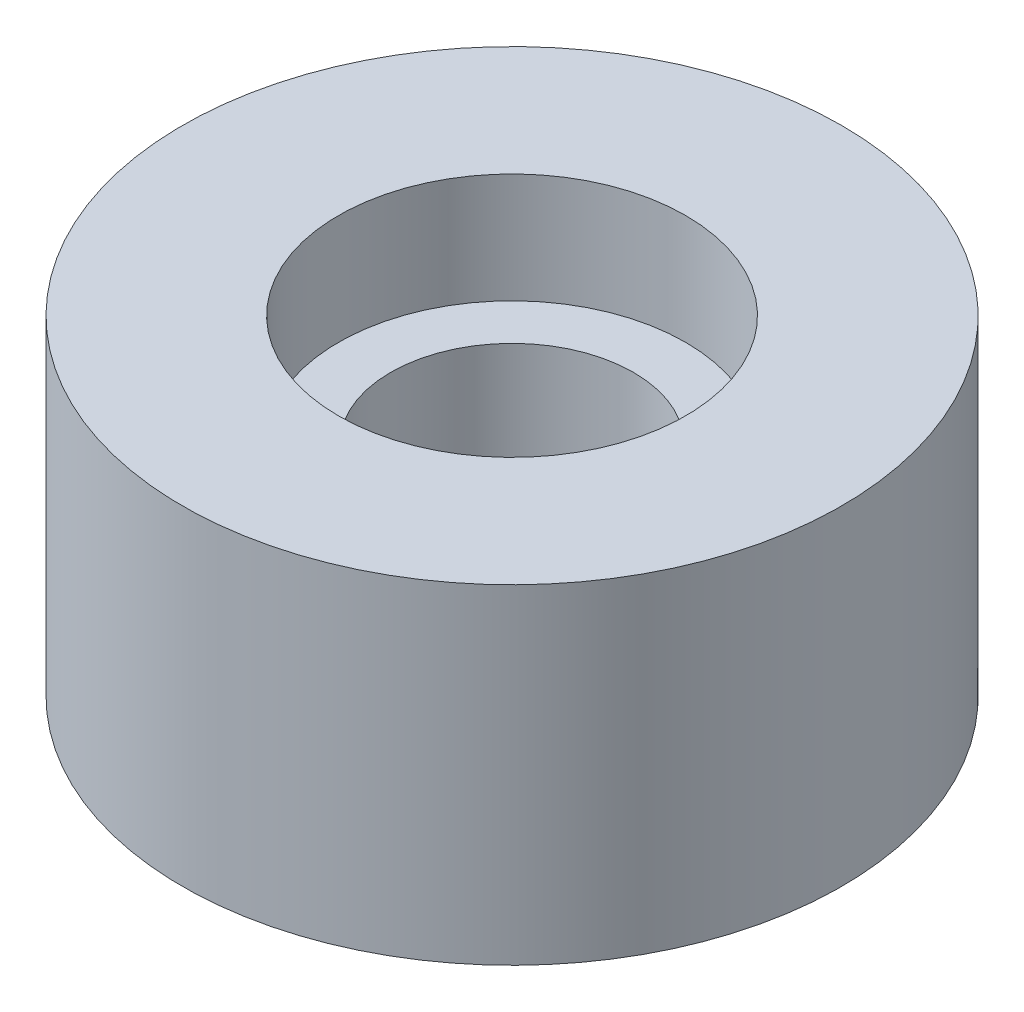
ISO-10303-21;
HEADER;
FILE_DESCRIPTION(('STEP AP214'),'2;1');
FILE_NAME('part.step','',(''),(''),'','','');
FILE_SCHEMA(('AUTOMOTIVE_DESIGN { 1 0 10303 214 1 1 1 1 }'));
ENDSEC;
DATA;
#1=APPLICATION_CONTEXT('core data for automotive mechanical design processes');
#2=APPLICATION_PROTOCOL_DEFINITION('international standard','automotive_design',2000,#1);
#3=PRODUCT_CONTEXT('',#1,'mechanical');
#4=PRODUCT('Part','Part','',(#3));
#5=PRODUCT_RELATED_PRODUCT_CATEGORY('part','',(#4));
#6=PRODUCT_DEFINITION_FORMATION('','',#4);
#7=PRODUCT_DEFINITION_CONTEXT('part definition',#1,'design');
#8=PRODUCT_DEFINITION('design','',#6,#7);
#9=PRODUCT_DEFINITION_SHAPE('','',#8);
#10=(LENGTH_UNIT() NAMED_UNIT(*) SI_UNIT(.MILLI.,.METRE.));
#11=(NAMED_UNIT(*) PLANE_ANGLE_UNIT() SI_UNIT($,.RADIAN.));
#12=(NAMED_UNIT(*) SI_UNIT($,.STERADIAN.) SOLID_ANGLE_UNIT());
#13=UNCERTAINTY_MEASURE_WITH_UNIT(LENGTH_MEASURE(1.E-05),#10,'distance_accuracy_value','');
#14=(GEOMETRIC_REPRESENTATION_CONTEXT(3) GLOBAL_UNCERTAINTY_ASSIGNED_CONTEXT((#13)) GLOBAL_UNIT_ASSIGNED_CONTEXT((#10,
#11,#12)) REPRESENTATION_CONTEXT('',''));
#15=CARTESIAN_POINT('',(0.,0.,0.));
#16=DIRECTION('',(0.,0.,1.));
#17=DIRECTION('',(1.,0.,0.));
#18=AXIS2_PLACEMENT_3D('',#15,#16,#17);
#19=CARTESIAN_POINT('',(0.,76.2,0.));
#20=DIRECTION('',(0.,-1.,0.));
#21=DIRECTION('',(0.,0.,-1.));
#22=AXIS2_PLACEMENT_3D('',#19,#20,#21);
#23=CYLINDRICAL_SURFACE('',#22,14.0462);
#24=CARTESIAN_POINT('',(0.,25.4,0.));
#25=DIRECTION('',(0.,1.,0.));
#26=DIRECTION('',(0.,0.,1.));
#27=AXIS2_PLACEMENT_3D('',#24,#25,#26);
#28=CIRCLE('',#27,14.0462);
#29=CARTESIAN_POINT('',(0.,25.4,-14.0462));
#30=VERTEX_POINT('',#29);
#31=EDGE_CURVE('E56',#30,#30,#28,.F.);
#32=CARTESIAN_POINT('',(0.,12.7,0.));
#33=DIRECTION('',(0.,-1.,0.));
#34=DIRECTION('',(0.,0.,-1.));
#35=AXIS2_PLACEMENT_3D('',#32,#33,#34);
#36=CIRCLE('',#35,14.0462);
#37=CARTESIAN_POINT('',(0.,12.7,-14.0462));
#38=VERTEX_POINT('',#37);
#39=EDGE_CURVE('E45',#38,#38,#36,.F.);
#40=CARTESIAN_POINT('',(0.,25.4,-14.0462));
#41=CARTESIAN_POINT('',(0.,25.2677083333333,-14.0462));
#42=CARTESIAN_POINT('',(0.,25.1354166666667,-14.0462));
#43=CARTESIAN_POINT('',(0.,24.8708333333333,-14.0462));
#44=CARTESIAN_POINT('',(0.,24.7385416666667,-14.0462));
#45=CARTESIAN_POINT('',(0.,24.4739583333333,-14.0462));
#46=CARTESIAN_POINT('',(0.,24.3416666666667,-14.0462));
#47=CARTESIAN_POINT('',(0.,24.0770833333333,-14.0462));
#48=CARTESIAN_POINT('',(0.,23.9447916666667,-14.0462));
#49=CARTESIAN_POINT('',(0.,23.6802083333333,-14.0462));
#50=CARTESIAN_POINT('',(0.,23.5479166666667,-14.0462));
#51=CARTESIAN_POINT('',(0.,23.2833333333333,-14.0462));
#52=CARTESIAN_POINT('',(0.,23.1510416666667,-14.0462));
#53=CARTESIAN_POINT('',(0.,22.8864583333333,-14.0462));
#54=CARTESIAN_POINT('',(0.,22.7541666666667,-14.0462));
#55=CARTESIAN_POINT('',(0.,22.4895833333333,-14.0462));
#56=CARTESIAN_POINT('',(0.,22.3572916666667,-14.0462));
#57=CARTESIAN_POINT('',(0.,22.0927083333333,-14.0462));
#58=CARTESIAN_POINT('',(0.,21.9604166666667,-14.0462));
#59=CARTESIAN_POINT('',(0.,21.6958333333333,-14.0462));
#60=CARTESIAN_POINT('',(0.,21.5635416666667,-14.0462));
#61=CARTESIAN_POINT('',(0.,21.2989583333333,-14.0462));
#62=CARTESIAN_POINT('',(0.,21.1666666666667,-14.0462));
#63=CARTESIAN_POINT('',(0.,20.9020833333333,-14.0462));
#64=CARTESIAN_POINT('',(0.,20.7697916666667,-14.0462));
#65=CARTESIAN_POINT('',(0.,20.5052083333333,-14.0462));
#66=CARTESIAN_POINT('',(0.,20.3729166666667,-14.0462));
#67=CARTESIAN_POINT('',(0.,20.1083333333333,-14.0462));
#68=CARTESIAN_POINT('',(0.,19.9760416666667,-14.0462));
#69=CARTESIAN_POINT('',(0.,19.7114583333333,-14.0462));
#70=CARTESIAN_POINT('',(0.,19.5791666666667,-14.0462));
#71=CARTESIAN_POINT('',(0.,19.3145833333333,-14.0462));
#72=CARTESIAN_POINT('',(0.,19.1822916666667,-14.0462));
#73=CARTESIAN_POINT('',(0.,18.9177083333333,-14.0462));
#74=CARTESIAN_POINT('',(0.,18.7854166666667,-14.0462));
#75=CARTESIAN_POINT('',(0.,18.5208333333333,-14.0462));
#76=CARTESIAN_POINT('',(0.,18.3885416666667,-14.0462));
#77=CARTESIAN_POINT('',(0.,18.1239583333333,-14.0462));
#78=CARTESIAN_POINT('',(0.,17.9916666666667,-14.0462));
#79=CARTESIAN_POINT('',(0.,17.7270833333333,-14.0462));
#80=CARTESIAN_POINT('',(0.,17.5947916666667,-14.0462));
#81=CARTESIAN_POINT('',(0.,17.3302083333333,-14.0462));
#82=CARTESIAN_POINT('',(0.,17.1979166666667,-14.0462));
#83=CARTESIAN_POINT('',(0.,16.9333333333333,-14.0462));
#84=CARTESIAN_POINT('',(0.,16.8010416666667,-14.0462));
#85=CARTESIAN_POINT('',(0.,16.5364583333333,-14.0462));
#86=CARTESIAN_POINT('',(0.,16.4041666666667,-14.0462));
#87=CARTESIAN_POINT('',(0.,16.1395833333333,-14.0462));
#88=CARTESIAN_POINT('',(0.,16.0072916666667,-14.0462));
#89=CARTESIAN_POINT('',(0.,15.7427083333333,-14.0462));
#90=CARTESIAN_POINT('',(0.,15.6104166666667,-14.0462));
#91=CARTESIAN_POINT('',(0.,15.3458333333333,-14.0462));
#92=CARTESIAN_POINT('',(0.,15.2135416666667,-14.0462));
#93=CARTESIAN_POINT('',(0.,14.9489583333333,-14.0462));
#94=CARTESIAN_POINT('',(0.,14.8166666666667,-14.0462));
#95=CARTESIAN_POINT('',(0.,14.5520833333333,-14.0462));
#96=CARTESIAN_POINT('',(0.,14.4197916666667,-14.0462));
#97=CARTESIAN_POINT('',(0.,14.1552083333333,-14.0462));
#98=CARTESIAN_POINT('',(0.,14.0229166666667,-14.0462));
#99=CARTESIAN_POINT('',(0.,13.7583333333333,-14.0462));
#100=CARTESIAN_POINT('',(0.,13.6260416666667,-14.0462));
#101=CARTESIAN_POINT('',(0.,13.3614583333333,-14.0462));
#102=CARTESIAN_POINT('',(0.,13.2291666666667,-14.0462));
#103=CARTESIAN_POINT('',(0.,12.9645833333334,-14.0462));
#104=CARTESIAN_POINT('',(0.,12.8322916666667,-14.0462));
#105=CARTESIAN_POINT('',(0.,12.7,-14.0462));
#106=B_SPLINE_CURVE_WITH_KNOTS('',3,(#40,#41,#42,#43,#44,#45,#46,#47,#48,#49,#50,#51,#52,#53,
#54,#55,#56,#57,#58,#59,#60,#61,#62,#63,#64,#65,#66,#67,#68,#69,#70,#71,#72,#73,#74,#75,#76,#77,
#78,#79,#80,#81,#82,#83,#84,#85,#86,#87,#88,#89,#90,#91,#92,#93,#94,#95,#96,#97,#98,#99,#100,
#101,#102,#103,#104,#105),.UNSPECIFIED.,.F.,.F.,(4,2,2,2,2,2,2,2,2,2,2,2,2,2,2,2,2,2,2,2,2,2,2,
2,2,2,2,2,2,2,2,2,4),(0.,0.396874999999998,0.793749999999996,1.190625,1.5875,1.984375,2.38125,
2.778125,3.175,3.571875,3.96874999999999,4.365625,4.7625,5.15937499999999,5.55625,5.953125,
6.34999999999999,6.74687499999999,7.14374999999999,7.540625,7.93749999999999,8.33437499999999,
8.73125,9.12812499999999,9.52499999999999,9.92187499999999,10.31875,10.715625,11.1125,11.509375,
11.90625,12.303125,12.7),.UNSPECIFIED.);
#107=EDGE_CURVE('BSEAM41',#30,#38,#106,.T.);
#108=ORIENTED_EDGE('',*,*,#31,.F.);
#109=ORIENTED_EDGE('',*,*,#39,.F.);
#110=ORIENTED_EDGE('',*,*,#107,.T.);
#111=ORIENTED_EDGE('',*,*,#107,.F.);
#112=EDGE_LOOP('',(#108,#110,#109,#111));
#113=FACE_BOUND('',#112,.T.);
#114=ADVANCED_FACE('F41',(#113),#23,.F.);
#115=CARTESIAN_POINT('',(0.,38.1,0.));
#116=DIRECTION('',(0.,-1.,0.));
#117=DIRECTION('',(0.,0.,-1.));
#118=AXIS2_PLACEMENT_3D('',#115,#116,#117);
#119=CYLINDRICAL_SURFACE('',#118,38.1);
#120=CARTESIAN_POINT('',(0.,38.1,0.));
#121=DIRECTION('',(0.,1.,0.));
#122=DIRECTION('',(0.,0.,1.));
#123=AXIS2_PLACEMENT_3D('',#120,#121,#122);
#124=CIRCLE('',#123,38.1);
#125=CARTESIAN_POINT('',(0.,38.1,-38.1));
#126=VERTEX_POINT('',#125);
#127=EDGE_CURVE('E10',#126,#126,#124,.T.);
#128=CARTESIAN_POINT('',(0.,0.,0.));
#129=DIRECTION('',(0.,1.,0.));
#130=DIRECTION('',(0.,0.,1.));
#131=AXIS2_PLACEMENT_3D('',#128,#129,#130);
#132=CIRCLE('',#131,38.1);
#133=CARTESIAN_POINT('',(0.,0.,-38.1));
#134=VERTEX_POINT('',#133);
#135=EDGE_CURVE('E50',#134,#134,#132,.T.);
#136=CARTESIAN_POINT('',(0.,38.1,-38.1));
#137=CARTESIAN_POINT('',(0.,37.703125,-38.1));
#138=CARTESIAN_POINT('',(0.,37.30625,-38.1));
#139=CARTESIAN_POINT('',(0.,36.5125,-38.1));
#140=CARTESIAN_POINT('',(0.,36.115625,-38.1));
#141=CARTESIAN_POINT('',(0.,35.321875,-38.1));
#142=CARTESIAN_POINT('',(0.,34.925,-38.1));
#143=CARTESIAN_POINT('',(0.,34.13125,-38.1));
#144=CARTESIAN_POINT('',(0.,33.734375,-38.1));
#145=CARTESIAN_POINT('',(0.,32.940625,-38.1));
#146=CARTESIAN_POINT('',(0.,32.54375,-38.1));
#147=CARTESIAN_POINT('',(0.,31.75,-38.1));
#148=CARTESIAN_POINT('',(0.,31.353125,-38.1));
#149=CARTESIAN_POINT('',(0.,30.559375,-38.1));
#150=CARTESIAN_POINT('',(0.,30.1625,-38.1));
#151=CARTESIAN_POINT('',(0.,29.36875,-38.1));
#152=CARTESIAN_POINT('',(0.,28.971875,-38.1));
#153=CARTESIAN_POINT('',(0.,28.178125,-38.1));
#154=CARTESIAN_POINT('',(0.,27.78125,-38.1));
#155=CARTESIAN_POINT('',(0.,26.9875,-38.1));
#156=CARTESIAN_POINT('',(0.,26.590625,-38.1));
#157=CARTESIAN_POINT('',(0.,25.796875,-38.1));
#158=CARTESIAN_POINT('',(0.,25.4,-38.1));
#159=CARTESIAN_POINT('',(0.,24.60625,-38.1));
#160=CARTESIAN_POINT('',(0.,24.209375,-38.1));
#161=CARTESIAN_POINT('',(0.,23.415625,-38.1));
#162=CARTESIAN_POINT('',(0.,23.01875,-38.1));
#163=CARTESIAN_POINT('',(0.,22.225,-38.1));
#164=CARTESIAN_POINT('',(0.,21.828125,-38.1));
#165=CARTESIAN_POINT('',(0.,21.034375,-38.1));
#166=CARTESIAN_POINT('',(0.,20.6375,-38.1));
#167=CARTESIAN_POINT('',(0.,19.84375,-38.1));
#168=CARTESIAN_POINT('',(0.,19.446875,-38.1));
#169=CARTESIAN_POINT('',(0.,18.653125,-38.1));
#170=CARTESIAN_POINT('',(0.,18.25625,-38.1));
#171=CARTESIAN_POINT('',(0.,17.4625,-38.1));
#172=CARTESIAN_POINT('',(0.,17.065625,-38.1));
#173=CARTESIAN_POINT('',(0.,16.271875,-38.1));
#174=CARTESIAN_POINT('',(0.,15.875,-38.1));
#175=CARTESIAN_POINT('',(0.,15.08125,-38.1));
#176=CARTESIAN_POINT('',(0.,14.684375,-38.1));
#177=CARTESIAN_POINT('',(0.,13.890625,-38.1));
#178=CARTESIAN_POINT('',(0.,13.49375,-38.1));
#179=CARTESIAN_POINT('',(0.,12.7,-38.1));
#180=CARTESIAN_POINT('',(0.,12.303125,-38.1));
#181=CARTESIAN_POINT('',(0.,11.509375,-38.1));
#182=CARTESIAN_POINT('',(0.,11.1125,-38.1));
#183=CARTESIAN_POINT('',(0.,10.31875,-38.1));
#184=CARTESIAN_POINT('',(0.,9.92187499999999,-38.1));
#185=CARTESIAN_POINT('',(0.,9.128125,-38.1));
#186=CARTESIAN_POINT('',(0.,8.73124999999999,-38.1));
#187=CARTESIAN_POINT('',(0.,7.93749999999999,-38.1));
#188=CARTESIAN_POINT('',(0.,7.54062499999999,-38.1));
#189=CARTESIAN_POINT('',(0.,6.746875,-38.1));
#190=CARTESIAN_POINT('',(0.,6.35,-38.1));
#191=CARTESIAN_POINT('',(0.,5.55625,-38.1));
#192=CARTESIAN_POINT('',(0.,5.159375,-38.1));
#193=CARTESIAN_POINT('',(0.,4.365625,-38.1));
#194=CARTESIAN_POINT('',(0.,3.96875,-38.1));
#195=CARTESIAN_POINT('',(0.,3.175,-38.1));
#196=CARTESIAN_POINT('',(0.,2.778125,-38.1));
#197=CARTESIAN_POINT('',(0.,1.984375,-38.1));
#198=CARTESIAN_POINT('',(0.,1.5875,-38.1));
#199=CARTESIAN_POINT('',(0.,0.79375,-38.1));
#200=CARTESIAN_POINT('',(0.,0.396875,-38.1));
#201=CARTESIAN_POINT('',(0.,0.,-38.1));
#202=B_SPLINE_CURVE_WITH_KNOTS('',3,(#136,#137,#138,#139,#140,#141,#142,#143,#144,#145,#146,
#147,#148,#149,#150,#151,#152,#153,#154,#155,#156,#157,#158,#159,#160,#161,#162,#163,#164,#165,
#166,#167,#168,#169,#170,#171,#172,#173,#174,#175,#176,#177,#178,#179,#180,#181,#182,#183,#184,
#185,#186,#187,#188,#189,#190,#191,#192,#193,#194,#195,#196,#197,#198,#199,#200,#201),
.UNSPECIFIED.,.F.,.F.,(4,2,2,2,2,2,2,2,2,2,2,2,2,2,2,2,2,2,2,2,2,2,2,2,2,2,2,2,2,2,2,2,4),(0.,
1.190625,2.38125,3.571875,4.7625,5.953125,7.14375,8.334375,9.52500000000001,10.715625,11.90625,
13.096875,14.2875,15.478125,16.66875,17.859375,19.05,20.240625,21.43125,22.621875,23.8125,
25.003125,26.19375,27.384375,28.575,29.765625,30.95625,32.146875,33.3375,34.528125,35.71875,
36.909375,38.1),.UNSPECIFIED.);
#203=EDGE_CURVE('BSEAM43',#126,#134,#202,.T.);
#204=ORIENTED_EDGE('',*,*,#127,.F.);
#205=ORIENTED_EDGE('',*,*,#135,.T.);
#206=ORIENTED_EDGE('',*,*,#203,.T.);
#207=ORIENTED_EDGE('',*,*,#203,.F.);
#208=EDGE_LOOP('',(#204,#206,#205,#207));
#209=FACE_BOUND('',#208,.T.);
#210=ADVANCED_FACE('F43',(#209),#119,.T.);
#211=CARTESIAN_POINT('',(0.,38.1,0.));
#212=DIRECTION('',(0.,1.,0.));
#213=DIRECTION('',(0.,0.,1.));
#214=AXIS2_PLACEMENT_3D('',#211,#212,#213);
#215=PLANE('',#214);
#216=CARTESIAN_POINT('',(0.,38.1,0.));
#217=DIRECTION('',(0.,1.,0.));
#218=DIRECTION('',(0.,0.,1.));
#219=AXIS2_PLACEMENT_3D('',#216,#217,#218);
#220=CIRCLE('',#219,20.066);
#221=CARTESIAN_POINT('',(0.,38.1,20.066));
#222=VERTEX_POINT('',#221);
#223=EDGE_CURVE('E59',#222,#222,#220,.T.);
#224=ORIENTED_EDGE('',*,*,#223,.F.);
#225=EDGE_LOOP('',(#224));
#226=FACE_BOUND('',#225,.T.);
#227=ORIENTED_EDGE('',*,*,#127,.T.);
#228=EDGE_LOOP('',(#227));
#229=FACE_BOUND('',#228,.T.);
#230=ADVANCED_FACE('F94',(#226,#229),#215,.T.);
#231=CARTESIAN_POINT('',(0.,0.,0.));
#232=DIRECTION('',(0.,1.,0.));
#233=DIRECTION('',(0.,0.,1.));
#234=AXIS2_PLACEMENT_3D('',#231,#232,#233);
#235=PLANE('',#234);
#236=CARTESIAN_POINT('',(0.,0.,0.));
#237=DIRECTION('',(0.,-1.,0.));
#238=DIRECTION('',(0.,0.,-1.));
#239=AXIS2_PLACEMENT_3D('',#236,#237,#238);
#240=CIRCLE('',#239,30.0355);
#241=CARTESIAN_POINT('',(0.,0.,-30.0355));
#242=VERTEX_POINT('',#241);
#243=EDGE_CURVE('E73',#242,#242,#240,.T.);
#244=ORIENTED_EDGE('',*,*,#243,.F.);
#245=EDGE_LOOP('',(#244));
#246=FACE_BOUND('',#245,.T.);
#247=ORIENTED_EDGE('',*,*,#135,.F.);
#248=EDGE_LOOP('',(#247));
#249=FACE_BOUND('',#248,.T.);
#250=ADVANCED_FACE('F101',(#246,#249),#235,.F.);
#251=CARTESIAN_POINT('',(0.,25.4,0.));
#252=DIRECTION('',(0.,1.,0.));
#253=DIRECTION('',(0.,0.,1.));
#254=AXIS2_PLACEMENT_3D('',#251,#252,#253);
#255=PLANE('',#254);
#256=CARTESIAN_POINT('',(0.,25.4,0.));
#257=DIRECTION('',(0.,1.,0.));
#258=DIRECTION('',(0.,0.,1.));
#259=AXIS2_PLACEMENT_3D('',#256,#257,#258);
#260=CIRCLE('',#259,20.066);
#261=CARTESIAN_POINT('',(0.,25.4,20.066));
#262=VERTEX_POINT('',#261);
#263=EDGE_CURVE('E63',#262,#262,#260,.T.);
#264=ORIENTED_EDGE('',*,*,#263,.T.);
#265=EDGE_LOOP('',(#264));
#266=FACE_BOUND('',#265,.T.);
#267=ORIENTED_EDGE('',*,*,#31,.T.);
#268=EDGE_LOOP('',(#267));
#269=FACE_BOUND('',#268,.T.);
#270=ADVANCED_FACE('F104',(#266,#269),#255,.T.);
#271=CARTESIAN_POINT('',(0.,25.4,0.));
#272=DIRECTION('',(0.,1.,0.));
#273=DIRECTION('',(0.,0.,1.));
#274=AXIS2_PLACEMENT_3D('',#271,#272,#273);
#275=CYLINDRICAL_SURFACE('',#274,20.066);
#276=ORIENTED_EDGE('',*,*,#263,.F.);
#277=EDGE_LOOP('',(#276));
#278=FACE_BOUND('',#277,.T.);
#279=ORIENTED_EDGE('',*,*,#223,.T.);
#280=EDGE_LOOP('',(#279));
#281=FACE_BOUND('',#280,.T.);
#282=ADVANCED_FACE('F98',(#278,#281),#275,.F.);
#283=CARTESIAN_POINT('',(0.,12.7,0.));
#284=DIRECTION('',(0.,-1.,0.));
#285=DIRECTION('',(0.,0.,-1.));
#286=AXIS2_PLACEMENT_3D('',#283,#284,#285);
#287=PLANE('',#286);
#288=CARTESIAN_POINT('',(0.,12.7,0.));
#289=DIRECTION('',(0.,-1.,0.));
#290=DIRECTION('',(0.,0.,-1.));
#291=AXIS2_PLACEMENT_3D('',#288,#289,#290);
#292=CIRCLE('',#291,30.0355);
#293=CARTESIAN_POINT('',(0.,12.7,-30.0355));
#294=VERTEX_POINT('',#293);
#295=EDGE_CURVE('E77',#294,#294,#292,.T.);
#296=ORIENTED_EDGE('',*,*,#295,.T.);
#297=EDGE_LOOP('',(#296));
#298=FACE_BOUND('',#297,.T.);
#299=ORIENTED_EDGE('',*,*,#39,.T.);
#300=EDGE_LOOP('',(#299));
#301=FACE_BOUND('',#300,.T.);
#302=ADVANCED_FACE('F86',(#298,#301),#287,.T.);
#303=CARTESIAN_POINT('',(0.,12.7,0.));
#304=DIRECTION('',(0.,-1.,0.));
#305=DIRECTION('',(0.,0.,-1.));
#306=AXIS2_PLACEMENT_3D('',#303,#304,#305);
#307=CYLINDRICAL_SURFACE('',#306,30.0355);
#308=ORIENTED_EDGE('',*,*,#295,.F.);
#309=EDGE_LOOP('',(#308));
#310=FACE_BOUND('',#309,.T.);
#311=ORIENTED_EDGE('',*,*,#243,.T.);
#312=EDGE_LOOP('',(#311));
#313=FACE_BOUND('',#312,.T.);
#314=ADVANCED_FACE('F114',(#310,#313),#307,.F.);
#315=CLOSED_SHELL('',(#114,#210,#230,#250,#270,#282,#302,#314));
#316=MANIFOLD_SOLID_BREP('B2',#315);
#317=ADVANCED_BREP_SHAPE_REPRESENTATION('',(#18,#316),#14);
#318=SHAPE_DEFINITION_REPRESENTATION(#9,#317);
ENDSEC;
END-ISO-10303-21;
